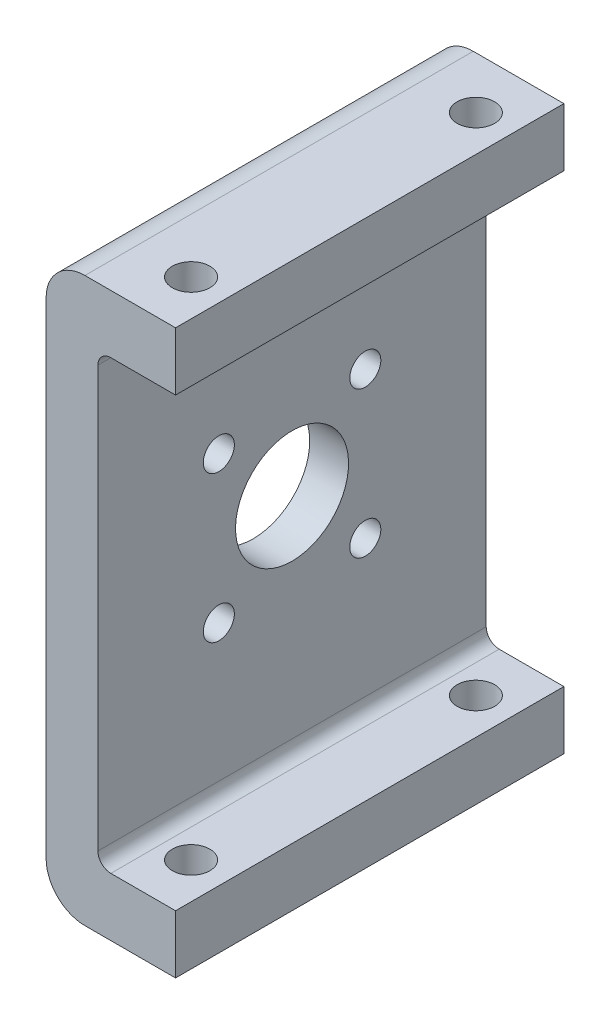
ISO-10303-21;
HEADER;
FILE_DESCRIPTION(('STEP AP214'),'2;1');
FILE_NAME('part.step','',(''),(''),'','','');
FILE_SCHEMA(('AUTOMOTIVE_DESIGN { 1 0 10303 214 1 1 1 1 }'));
ENDSEC;
DATA;
#1=APPLICATION_CONTEXT('core data for automotive mechanical design processes');
#2=APPLICATION_PROTOCOL_DEFINITION('international standard','automotive_design',2000,#1);
#3=PRODUCT_CONTEXT('',#1,'mechanical');
#4=PRODUCT('Part','Part','',(#3));
#5=PRODUCT_RELATED_PRODUCT_CATEGORY('part','',(#4));
#6=PRODUCT_DEFINITION_FORMATION('','',#4);
#7=PRODUCT_DEFINITION_CONTEXT('part definition',#1,'design');
#8=PRODUCT_DEFINITION('design','',#6,#7);
#9=PRODUCT_DEFINITION_SHAPE('','',#8);
#10=(LENGTH_UNIT() NAMED_UNIT(*) SI_UNIT(.MILLI.,.METRE.));
#11=(NAMED_UNIT(*) PLANE_ANGLE_UNIT() SI_UNIT($,.RADIAN.));
#12=(NAMED_UNIT(*) SI_UNIT($,.STERADIAN.) SOLID_ANGLE_UNIT());
#13=UNCERTAINTY_MEASURE_WITH_UNIT(LENGTH_MEASURE(1.E-05),#10,'distance_accuracy_value','');
#14=(GEOMETRIC_REPRESENTATION_CONTEXT(3) GLOBAL_UNCERTAINTY_ASSIGNED_CONTEXT((#13)) GLOBAL_UNIT_ASSIGNED_CONTEXT((#10,
#11,#12)) REPRESENTATION_CONTEXT('',''));
#15=CARTESIAN_POINT('',(0.,0.,0.));
#16=DIRECTION('',(0.,0.,1.));
#17=DIRECTION('',(1.,0.,0.));
#18=AXIS2_PLACEMENT_3D('',#15,#16,#17);
#19=CARTESIAN_POINT('',(0.,0.,0.));
#20=DIRECTION('',(1.,0.,0.));
#21=DIRECTION('',(0.,1.,0.));
#22=AXIS2_PLACEMENT_3D('',#19,#20,#21);
#23=CYLINDRICAL_SURFACE('',#22,4.365625);
#24=CARTESIAN_POINT('',(4.,0.,0.));
#25=DIRECTION('',(-1.,0.,0.));
#26=DIRECTION('',(0.,-1.,0.));
#27=AXIS2_PLACEMENT_3D('',#24,#25,#26);
#28=CIRCLE('',#27,4.365625);
#29=CARTESIAN_POINT('',(4.,-4.365625,0.));
#30=VERTEX_POINT('',#29);
#31=EDGE_CURVE('E195',#30,#30,#28,.T.);
#32=ORIENTED_EDGE('',*,*,#31,.F.);
#33=EDGE_LOOP('',(#32));
#34=FACE_BOUND('',#33,.T.);
#35=CARTESIAN_POINT('',(1.,0.,0.));
#36=DIRECTION('',(-1.,0.,0.));
#37=DIRECTION('',(0.,-1.,0.));
#38=AXIS2_PLACEMENT_3D('',#35,#36,#37);
#39=CIRCLE('',#38,4.365625);
#40=CARTESIAN_POINT('',(1.,-4.365625,0.));
#41=VERTEX_POINT('',#40);
#42=EDGE_CURVE('E208',#41,#41,#39,.F.);
#43=ORIENTED_EDGE('',*,*,#42,.F.);
#44=EDGE_LOOP('',(#43));
#45=FACE_BOUND('',#44,.T.);
#46=ADVANCED_FACE('F45',(#34,#45),#23,.F.);
#47=CARTESIAN_POINT('',(0.,5.656854249492,-5.656854249492));
#48=DIRECTION('',(-1.,0.,0.));
#49=DIRECTION('',(0.,0.,1.));
#50=AXIS2_PLACEMENT_3D('',#47,#48,#49);
#51=CYLINDRICAL_SURFACE('',#50,1.19999999999999);
#52=CARTESIAN_POINT('',(4.,5.656854249492,-5.656854249492));
#53=DIRECTION('',(-1.,0.,0.));
#54=DIRECTION('',(0.,-1.,0.));
#55=AXIS2_PLACEMENT_3D('',#52,#53,#54);
#56=CIRCLE('',#55,1.19999999999999);
#57=CARTESIAN_POINT('',(4.,4.45685424949201,-5.656854249492));
#58=VERTEX_POINT('',#57);
#59=EDGE_CURVE('E191',#58,#58,#56,.T.);
#60=ORIENTED_EDGE('',*,*,#59,.F.);
#61=EDGE_LOOP('',(#60));
#62=FACE_BOUND('',#61,.T.);
#63=CARTESIAN_POINT('',(0.999999999999998,5.656854249492,-5.656854249492));
#64=DIRECTION('',(-1.,0.,0.));
#65=DIRECTION('',(0.,-1.,0.));
#66=AXIS2_PLACEMENT_3D('',#63,#64,#65);
#67=CIRCLE('',#66,1.19999999999999);
#68=CARTESIAN_POINT('',(0.999999999999999,4.45685424949201,-5.656854249492));
#69=VERTEX_POINT('',#68);
#70=EDGE_CURVE('E373',#69,#69,#67,.F.);
#71=ORIENTED_EDGE('',*,*,#70,.F.);
#72=EDGE_LOOP('',(#71));
#73=FACE_BOUND('',#72,.T.);
#74=ADVANCED_FACE('F414',(#62,#73),#51,.F.);
#75=CARTESIAN_POINT('',(0.,-5.656854249492,-5.656854249492));
#76=DIRECTION('',(-1.,0.,0.));
#77=DIRECTION('',(0.,0.,1.));
#78=AXIS2_PLACEMENT_3D('',#75,#76,#77);
#79=CYLINDRICAL_SURFACE('',#78,1.19999999999999);
#80=CARTESIAN_POINT('',(4.,-5.656854249492,-5.656854249492));
#81=DIRECTION('',(-1.,0.,0.));
#82=DIRECTION('',(0.,-1.,0.));
#83=AXIS2_PLACEMENT_3D('',#80,#81,#82);
#84=CIRCLE('',#83,1.19999999999999);
#85=CARTESIAN_POINT('',(4.,-6.85685424949199,-5.656854249492));
#86=VERTEX_POINT('',#85);
#87=EDGE_CURVE('E196',#86,#86,#84,.T.);
#88=ORIENTED_EDGE('',*,*,#87,.F.);
#89=EDGE_LOOP('',(#88));
#90=FACE_BOUND('',#89,.T.);
#91=CARTESIAN_POINT('',(1.,-5.656854249492,-5.656854249492));
#92=DIRECTION('',(-1.,0.,0.));
#93=DIRECTION('',(0.,-1.,0.));
#94=AXIS2_PLACEMENT_3D('',#91,#92,#93);
#95=CIRCLE('',#94,1.19999999999999);
#96=CARTESIAN_POINT('',(1.,-6.85685424949199,-5.656854249492));
#97=VERTEX_POINT('',#96);
#98=EDGE_CURVE('E377',#97,#97,#95,.F.);
#99=ORIENTED_EDGE('',*,*,#98,.F.);
#100=EDGE_LOOP('',(#99));
#101=FACE_BOUND('',#100,.T.);
#102=ADVANCED_FACE('F420',(#90,#101),#79,.F.);
#103=CARTESIAN_POINT('',(0.,-5.656854249492,5.656854249492));
#104=DIRECTION('',(-1.,0.,0.));
#105=DIRECTION('',(0.,0.,1.));
#106=AXIS2_PLACEMENT_3D('',#103,#104,#105);
#107=CYLINDRICAL_SURFACE('',#106,1.19999999999999);
#108=CARTESIAN_POINT('',(4.,-5.656854249492,5.656854249492));
#109=DIRECTION('',(-1.,0.,0.));
#110=DIRECTION('',(0.,-1.,0.));
#111=AXIS2_PLACEMENT_3D('',#108,#109,#110);
#112=CIRCLE('',#111,1.19999999999999);
#113=CARTESIAN_POINT('',(4.,-6.85685424949199,5.656854249492));
#114=VERTEX_POINT('',#113);
#115=EDGE_CURVE('E200',#114,#114,#112,.T.);
#116=ORIENTED_EDGE('',*,*,#115,.F.);
#117=EDGE_LOOP('',(#116));
#118=FACE_BOUND('',#117,.T.);
#119=CARTESIAN_POINT('',(1.,-5.656854249492,5.656854249492));
#120=DIRECTION('',(-1.,0.,0.));
#121=DIRECTION('',(0.,-1.,0.));
#122=AXIS2_PLACEMENT_3D('',#119,#120,#121);
#123=CIRCLE('',#122,1.19999999999999);
#124=CARTESIAN_POINT('',(1.,-6.85685424949199,5.656854249492));
#125=VERTEX_POINT('',#124);
#126=EDGE_CURVE('E212',#125,#125,#123,.F.);
#127=ORIENTED_EDGE('',*,*,#126,.F.);
#128=EDGE_LOOP('',(#127));
#129=FACE_BOUND('',#128,.T.);
#130=ADVANCED_FACE('F446',(#118,#129),#107,.F.);
#131=CARTESIAN_POINT('',(0.,5.656854249492,5.656854249492));
#132=DIRECTION('',(-1.,0.,0.));
#133=DIRECTION('',(0.,0.,1.));
#134=AXIS2_PLACEMENT_3D('',#131,#132,#133);
#135=CYLINDRICAL_SURFACE('',#134,1.19999999999999);
#136=CARTESIAN_POINT('',(4.,5.656854249492,5.656854249492));
#137=DIRECTION('',(-1.,0.,0.));
#138=DIRECTION('',(0.,-1.,0.));
#139=AXIS2_PLACEMENT_3D('',#136,#137,#138);
#140=CIRCLE('',#139,1.19999999999999);
#141=CARTESIAN_POINT('',(4.,4.45685424949201,5.656854249492));
#142=VERTEX_POINT('',#141);
#143=EDGE_CURVE('E204',#142,#142,#140,.T.);
#144=ORIENTED_EDGE('',*,*,#143,.F.);
#145=EDGE_LOOP('',(#144));
#146=FACE_BOUND('',#145,.T.);
#147=CARTESIAN_POINT('',(0.999999999999998,5.656854249492,5.656854249492));
#148=DIRECTION('',(-1.,0.,0.));
#149=DIRECTION('',(0.,-1.,0.));
#150=AXIS2_PLACEMENT_3D('',#147,#148,#149);
#151=CIRCLE('',#150,1.19999999999999);
#152=CARTESIAN_POINT('',(0.999999999999999,4.45685424949201,5.656854249492));
#153=VERTEX_POINT('',#152);
#154=EDGE_CURVE('E209',#153,#153,#151,.F.);
#155=ORIENTED_EDGE('',*,*,#154,.F.);
#156=EDGE_LOOP('',(#155));
#157=FACE_BOUND('',#156,.T.);
#158=ADVANCED_FACE('F439',(#146,#157),#135,.F.);
#159=CARTESIAN_POINT('',(0.,-21.75,15.));
#160=DIRECTION('',(0.,1.,0.));
#161=DIRECTION('',(0.,0.,1.));
#162=AXIS2_PLACEMENT_3D('',#159,#160,#161);
#163=PLANE('',#162);
#164=CARTESIAN_POINT('',(7.20000000000095,-21.75,-11.));
#165=DIRECTION('',(0.,-1.,0.));
#166=DIRECTION('',(0.,0.,-1.));
#167=AXIS2_PLACEMENT_3D('',#164,#165,#166);
#168=CIRCLE('',#167,1.45);
#169=CARTESIAN_POINT('',(7.20000000000095,-21.75,-12.45));
#170=VERTEX_POINT('',#169);
#171=EDGE_CURVE('E353',#170,#170,#168,.T.);
#172=ORIENTED_EDGE('',*,*,#171,.F.);
#173=EDGE_LOOP('',(#172));
#174=FACE_BOUND('',#173,.T.);
#175=DIRECTION('',(1.,0.,0.));
#176=VECTOR('',#175,1.);
#177=CARTESIAN_POINT('',(0.,-21.75,15.));
#178=LINE('',#177,#176);
#179=CARTESIAN_POINT('',(3.,-21.75,15.));
#180=VERTEX_POINT('',#179);
#181=CARTESIAN_POINT('',(10.,-21.75,15.));
#182=VERTEX_POINT('',#181);
#183=EDGE_CURVE('E155',#180,#182,#178,.T.);
#184=ORIENTED_EDGE('',*,*,#183,.F.);
#185=DIRECTION('',(0.,0.,-1.));
#186=VECTOR('',#185,1.);
#187=CARTESIAN_POINT('',(3.,-21.75,15.));
#188=LINE('',#187,#186);
#189=CARTESIAN_POINT('',(3.,-21.75,-15.));
#190=VERTEX_POINT('',#189);
#191=EDGE_CURVE('E236',#180,#190,#188,.T.);
#192=ORIENTED_EDGE('',*,*,#191,.T.);
#193=DIRECTION('',(1.,0.,0.));
#194=VECTOR('',#193,1.);
#195=CARTESIAN_POINT('',(0.,-21.75,-15.));
#196=LINE('',#195,#194);
#197=CARTESIAN_POINT('',(10.,-21.75,-15.));
#198=VERTEX_POINT('',#197);
#199=EDGE_CURVE('E160',#190,#198,#196,.T.);
#200=ORIENTED_EDGE('',*,*,#199,.T.);
#201=DIRECTION('',(0.,0.,-1.));
#202=VECTOR('',#201,1.);
#203=CARTESIAN_POINT('',(10.,-21.75,15.));
#204=LINE('',#203,#202);
#205=EDGE_CURVE('E264',#182,#198,#204,.T.);
#206=ORIENTED_EDGE('',*,*,#205,.F.);
#207=EDGE_LOOP('',(#184,#192,#200,#206));
#208=FACE_BOUND('',#207,.T.);
#209=CARTESIAN_POINT('',(7.20000000000095,-21.75,11.));
#210=DIRECTION('',(0.,-1.,0.));
#211=DIRECTION('',(0.,0.,-1.));
#212=AXIS2_PLACEMENT_3D('',#209,#210,#211);
#213=CIRCLE('',#212,1.45);
#214=CARTESIAN_POINT('',(7.20000000000095,-21.75,9.55));
#215=VERTEX_POINT('',#214);
#216=EDGE_CURVE('E363',#215,#215,#213,.T.);
#217=ORIENTED_EDGE('',*,*,#216,.F.);
#218=EDGE_LOOP('',(#217));
#219=FACE_BOUND('',#218,.T.);
#220=ADVANCED_FACE('F261',(#174,#208,#219),#163,.F.);
#221=CARTESIAN_POINT('',(10.,-21.75,15.));
#222=DIRECTION('',(-1.,0.,0.));
#223=DIRECTION('',(0.,-1.,0.));
#224=AXIS2_PLACEMENT_3D('',#221,#222,#223);
#225=PLANE('',#224);
#226=DIRECTION('',(0.,1.,0.));
#227=VECTOR('',#226,1.);
#228=CARTESIAN_POINT('',(10.,-21.75,-15.));
#229=LINE('',#228,#227);
#230=CARTESIAN_POINT('',(10.,-17.25,-15.));
#231=VERTEX_POINT('',#230);
#232=EDGE_CURVE('E164',#198,#231,#229,.T.);
#233=ORIENTED_EDGE('',*,*,#232,.T.);
#234=DIRECTION('',(0.,0.,-1.));
#235=VECTOR('',#234,1.);
#236=CARTESIAN_POINT('',(10.,-17.25,15.));
#237=LINE('',#236,#235);
#238=CARTESIAN_POINT('',(10.,-17.25,15.));
#239=VERTEX_POINT('',#238);
#240=EDGE_CURVE('E142',#239,#231,#237,.T.);
#241=ORIENTED_EDGE('',*,*,#240,.F.);
#242=DIRECTION('',(0.,1.,0.));
#243=VECTOR('',#242,1.);
#244=CARTESIAN_POINT('',(10.,-21.75,15.));
#245=LINE('',#244,#243);
#246=EDGE_CURVE('E150',#182,#239,#245,.T.);
#247=ORIENTED_EDGE('',*,*,#246,.F.);
#248=ORIENTED_EDGE('',*,*,#205,.T.);
#249=EDGE_LOOP('',(#233,#241,#247,#248));
#250=FACE_BOUND('',#249,.T.);
#251=ADVANCED_FACE('F162',(#250),#225,.F.);
#252=CARTESIAN_POINT('',(10.,-17.25,15.));
#253=DIRECTION('',(0.,-1.,0.));
#254=DIRECTION('',(1.,0.,0.));
#255=AXIS2_PLACEMENT_3D('',#252,#253,#254);
#256=PLANE('',#255);
#257=CARTESIAN_POINT('',(7.20000000000095,-17.25,11.));
#258=DIRECTION('',(0.,-1.,0.));
#259=DIRECTION('',(1.,0.,0.));
#260=AXIS2_PLACEMENT_3D('',#257,#258,#259);
#261=CIRCLE('',#260,1.44999999999999);
#262=CARTESIAN_POINT('',(8.65000000000095,-17.25,11.));
#263=VERTEX_POINT('',#262);
#264=EDGE_CURVE('E189',#263,#263,#261,.T.);
#265=ORIENTED_EDGE('',*,*,#264,.T.);
#266=EDGE_LOOP('',(#265));
#267=FACE_BOUND('',#266,.T.);
#268=CARTESIAN_POINT('',(7.20000000000095,-17.25,-11.));
#269=DIRECTION('',(0.,-1.,0.));
#270=DIRECTION('',(1.,0.,0.));
#271=AXIS2_PLACEMENT_3D('',#268,#269,#270);
#272=CIRCLE('',#271,1.44999999999999);
#273=CARTESIAN_POINT('',(8.65000000000095,-17.25,-11.));
#274=VERTEX_POINT('',#273);
#275=EDGE_CURVE('E179',#274,#274,#272,.T.);
#276=ORIENTED_EDGE('',*,*,#275,.T.);
#277=EDGE_LOOP('',(#276));
#278=FACE_BOUND('',#277,.T.);
#279=DIRECTION('',(-1.,0.,0.));
#280=VECTOR('',#279,1.);
#281=CARTESIAN_POINT('',(10.,-17.25,-15.));
#282=LINE('',#281,#280);
#283=CARTESIAN_POINT('',(5.00000000000001,-17.25,-15.));
#284=VERTEX_POINT('',#283);
#285=EDGE_CURVE('E309',#231,#284,#282,.T.);
#286=ORIENTED_EDGE('',*,*,#285,.T.);
#287=DIRECTION('',(0.,0.,-1.));
#288=VECTOR('',#287,1.);
#289=CARTESIAN_POINT('',(5.00000000000001,-17.25,15.));
#290=LINE('',#289,#288);
#291=CARTESIAN_POINT('',(5.00000000000001,-17.25,15.));
#292=VERTEX_POINT('',#291);
#293=EDGE_CURVE('E145',#284,#292,#290,.F.);
#294=ORIENTED_EDGE('',*,*,#293,.T.);
#295=DIRECTION('',(-1.,0.,0.));
#296=VECTOR('',#295,1.);
#297=CARTESIAN_POINT('',(10.,-17.25,15.));
#298=LINE('',#297,#296);
#299=EDGE_CURVE('E137',#239,#292,#298,.T.);
#300=ORIENTED_EDGE('',*,*,#299,.F.);
#301=ORIENTED_EDGE('',*,*,#240,.T.);
#302=EDGE_LOOP('',(#286,#294,#300,#301));
#303=FACE_BOUND('',#302,.T.);
#304=ADVANCED_FACE('F140',(#267,#278,#303),#256,.F.);
#305=CARTESIAN_POINT('',(4.00000000000001,-17.25,15.));
#306=DIRECTION('',(-1.,0.,0.));
#307=DIRECTION('',(0.,-1.,0.));
#308=AXIS2_PLACEMENT_3D('',#305,#306,#307);
#309=PLANE('',#308);
#310=ORIENTED_EDGE('',*,*,#143,.T.);
#311=EDGE_LOOP('',(#310));
#312=FACE_BOUND('',#311,.T.);
#313=ORIENTED_EDGE('',*,*,#115,.T.);
#314=EDGE_LOOP('',(#313));
#315=FACE_BOUND('',#314,.T.);
#316=ORIENTED_EDGE('',*,*,#87,.T.);
#317=EDGE_LOOP('',(#316));
#318=FACE_BOUND('',#317,.T.);
#319=ORIENTED_EDGE('',*,*,#59,.T.);
#320=EDGE_LOOP('',(#319));
#321=FACE_BOUND('',#320,.T.);
#322=ORIENTED_EDGE('',*,*,#31,.T.);
#323=EDGE_LOOP('',(#322));
#324=FACE_BOUND('',#323,.T.);
#325=DIRECTION('',(0.,1.,0.));
#326=VECTOR('',#325,1.);
#327=CARTESIAN_POINT('',(4.00000000000001,-17.25,15.));
#328=LINE('',#327,#326);
#329=CARTESIAN_POINT('',(4.00000000000001,-16.25,15.));
#330=VERTEX_POINT('',#329);
#331=CARTESIAN_POINT('',(3.99999999999999,16.25,15.));
#332=VERTEX_POINT('',#331);
#333=EDGE_CURVE('E149',#330,#332,#328,.T.);
#334=ORIENTED_EDGE('',*,*,#333,.F.);
#335=DIRECTION('',(0.,0.,-1.));
#336=VECTOR('',#335,1.);
#337=CARTESIAN_POINT('',(4.00000000000001,-16.25,-15.));
#338=LINE('',#337,#336);
#339=CARTESIAN_POINT('',(4.00000000000001,-16.25,-15.));
#340=VERTEX_POINT('',#339);
#341=EDGE_CURVE('E172',#330,#340,#338,.T.);
#342=ORIENTED_EDGE('',*,*,#341,.T.);
#343=DIRECTION('',(0.,1.,0.));
#344=VECTOR('',#343,1.);
#345=CARTESIAN_POINT('',(4.00000000000001,-17.25,-15.));
#346=LINE('',#345,#344);
#347=CARTESIAN_POINT('',(3.99999999999999,16.25,-15.));
#348=VERTEX_POINT('',#347);
#349=EDGE_CURVE('E312',#340,#348,#346,.T.);
#350=ORIENTED_EDGE('',*,*,#349,.T.);
#351=DIRECTION('',(0.,0.,-1.));
#352=VECTOR('',#351,1.);
#353=CARTESIAN_POINT('',(3.99999999999999,16.25,15.));
#354=LINE('',#353,#352);
#355=EDGE_CURVE('E166',#348,#332,#354,.F.);
#356=ORIENTED_EDGE('',*,*,#355,.T.);
#357=EDGE_LOOP('',(#334,#342,#350,#356));
#358=FACE_BOUND('',#357,.T.);
#359=ADVANCED_FACE('F332',(#312,#315,#318,#321,#324,#358),#309,.F.);
#360=CARTESIAN_POINT('',(3.99999999999999,17.25,15.));
#361=DIRECTION('',(0.,1.,0.));
#362=DIRECTION('',(0.,0.,1.));
#363=AXIS2_PLACEMENT_3D('',#360,#361,#362);
#364=PLANE('',#363);
#365=CARTESIAN_POINT('',(7.20000000000095,17.25,11.));
#366=DIRECTION('',(0.,1.,0.));
#367=DIRECTION('',(0.,0.,1.));
#368=AXIS2_PLACEMENT_3D('',#365,#366,#367);
#369=CIRCLE('',#368,1.44999999999999);
#370=CARTESIAN_POINT('',(7.20000000000095,17.25,12.45));
#371=VERTEX_POINT('',#370);
#372=EDGE_CURVE('E185',#371,#371,#369,.T.);
#373=ORIENTED_EDGE('',*,*,#372,.T.);
#374=EDGE_LOOP('',(#373));
#375=FACE_BOUND('',#374,.T.);
#376=CARTESIAN_POINT('',(7.20000000000095,17.25,-11.));
#377=DIRECTION('',(0.,1.,0.));
#378=DIRECTION('',(0.,0.,1.));
#379=AXIS2_PLACEMENT_3D('',#376,#377,#378);
#380=CIRCLE('',#379,1.44999999999999);
#381=CARTESIAN_POINT('',(7.20000000000095,17.25,-9.55000000000001));
#382=VERTEX_POINT('',#381);
#383=EDGE_CURVE('E183',#382,#382,#380,.T.);
#384=ORIENTED_EDGE('',*,*,#383,.T.);
#385=EDGE_LOOP('',(#384));
#386=FACE_BOUND('',#385,.T.);
#387=DIRECTION('',(1.,0.,0.));
#388=VECTOR('',#387,1.);
#389=CARTESIAN_POINT('',(3.99999999999999,17.25,15.));
#390=LINE('',#389,#388);
#391=CARTESIAN_POINT('',(4.99999999999999,17.25,15.));
#392=VERTEX_POINT('',#391);
#393=CARTESIAN_POINT('',(9.99999999999999,17.25,15.));
#394=VERTEX_POINT('',#393);
#395=EDGE_CURVE('E325',#392,#394,#390,.T.);
#396=ORIENTED_EDGE('',*,*,#395,.F.);
#397=DIRECTION('',(0.,0.,-1.));
#398=VECTOR('',#397,1.);
#399=CARTESIAN_POINT('',(4.99999999999999,17.25,-15.));
#400=LINE('',#399,#398);
#401=CARTESIAN_POINT('',(4.99999999999999,17.25,-15.));
#402=VERTEX_POINT('',#401);
#403=EDGE_CURVE('E220',#392,#402,#400,.T.);
#404=ORIENTED_EDGE('',*,*,#403,.T.);
#405=DIRECTION('',(1.,0.,0.));
#406=VECTOR('',#405,1.);
#407=CARTESIAN_POINT('',(3.99999999999999,17.25,-15.));
#408=LINE('',#407,#406);
#409=CARTESIAN_POINT('',(9.99999999999999,17.25,-15.));
#410=VERTEX_POINT('',#409);
#411=EDGE_CURVE('E316',#402,#410,#408,.T.);
#412=ORIENTED_EDGE('',*,*,#411,.T.);
#413=DIRECTION('',(0.,0.,-1.));
#414=VECTOR('',#413,1.);
#415=CARTESIAN_POINT('',(9.99999999999999,17.25,15.));
#416=LINE('',#415,#414);
#417=EDGE_CURVE('E167',#394,#410,#416,.T.);
#418=ORIENTED_EDGE('',*,*,#417,.F.);
#419=EDGE_LOOP('',(#396,#404,#412,#418));
#420=FACE_BOUND('',#419,.T.);
#421=ADVANCED_FACE('F324',(#375,#386,#420),#364,.F.);
#422=CARTESIAN_POINT('',(9.99999999999999,17.25,15.));
#423=DIRECTION('',(-1.,0.,0.));
#424=DIRECTION('',(0.,-1.,0.));
#425=AXIS2_PLACEMENT_3D('',#422,#423,#424);
#426=PLANE('',#425);
#427=DIRECTION('',(0.,1.,0.));
#428=VECTOR('',#427,1.);
#429=CARTESIAN_POINT('',(9.99999999999999,17.25,-15.));
#430=LINE('',#429,#428);
#431=CARTESIAN_POINT('',(9.99999999999999,21.75,-15.));
#432=VERTEX_POINT('',#431);
#433=EDGE_CURVE('E281',#410,#432,#430,.T.);
#434=ORIENTED_EDGE('',*,*,#433,.T.);
#435=DIRECTION('',(0.,0.,-1.));
#436=VECTOR('',#435,1.);
#437=CARTESIAN_POINT('',(9.99999999999999,21.75,15.));
#438=LINE('',#437,#436);
#439=CARTESIAN_POINT('',(9.99999999999999,21.75,15.));
#440=VERTEX_POINT('',#439);
#441=EDGE_CURVE('E175',#440,#432,#438,.T.);
#442=ORIENTED_EDGE('',*,*,#441,.F.);
#443=DIRECTION('',(0.,1.,0.));
#444=VECTOR('',#443,1.);
#445=CARTESIAN_POINT('',(9.99999999999999,17.25,15.));
#446=LINE('',#445,#444);
#447=EDGE_CURVE('E303',#394,#440,#446,.T.);
#448=ORIENTED_EDGE('',*,*,#447,.F.);
#449=ORIENTED_EDGE('',*,*,#417,.T.);
#450=EDGE_LOOP('',(#434,#442,#448,#449));
#451=FACE_BOUND('',#450,.T.);
#452=ADVANCED_FACE('F320',(#451),#426,.F.);
#453=CARTESIAN_POINT('',(9.99999999999999,21.75,15.));
#454=DIRECTION('',(0.,-1.,0.));
#455=DIRECTION('',(1.,0.,0.));
#456=AXIS2_PLACEMENT_3D('',#453,#454,#455);
#457=PLANE('',#456);
#458=CARTESIAN_POINT('',(7.20000000000095,21.75,11.));
#459=DIRECTION('',(0.,-1.,0.));
#460=DIRECTION('',(0.,0.,-1.));
#461=AXIS2_PLACEMENT_3D('',#458,#459,#460);
#462=CIRCLE('',#461,1.44999999999999);
#463=CARTESIAN_POINT('',(7.20000000000095,21.75,9.55000000000001));
#464=VERTEX_POINT('',#463);
#465=EDGE_CURVE('E190',#464,#464,#462,.T.);
#466=ORIENTED_EDGE('',*,*,#465,.T.);
#467=EDGE_LOOP('',(#466));
#468=FACE_BOUND('',#467,.T.);
#469=CARTESIAN_POINT('',(7.20000000000095,21.75,-11.));
#470=DIRECTION('',(0.,-1.,0.));
#471=DIRECTION('',(0.,0.,-1.));
#472=AXIS2_PLACEMENT_3D('',#469,#470,#471);
#473=CIRCLE('',#472,1.44999999999999);
#474=CARTESIAN_POINT('',(7.20000000000095,21.75,-12.45));
#475=VERTEX_POINT('',#474);
#476=EDGE_CURVE('E184',#475,#475,#473,.T.);
#477=ORIENTED_EDGE('',*,*,#476,.T.);
#478=EDGE_LOOP('',(#477));
#479=FACE_BOUND('',#478,.T.);
#480=DIRECTION('',(-1.,0.,0.));
#481=VECTOR('',#480,1.);
#482=CARTESIAN_POINT('',(9.99999999999999,21.75,-15.));
#483=LINE('',#482,#481);
#484=CARTESIAN_POINT('',(2.99999999999999,21.75,-15.));
#485=VERTEX_POINT('',#484);
#486=EDGE_CURVE('E275',#432,#485,#483,.T.);
#487=ORIENTED_EDGE('',*,*,#486,.T.);
#488=DIRECTION('',(0.,0.,-1.));
#489=VECTOR('',#488,1.);
#490=CARTESIAN_POINT('',(2.99999999999999,21.75,15.));
#491=LINE('',#490,#489);
#492=CARTESIAN_POINT('',(2.99999999999999,21.75,15.));
#493=VERTEX_POINT('',#492);
#494=EDGE_CURVE('E11',#485,#493,#491,.F.);
#495=ORIENTED_EDGE('',*,*,#494,.T.);
#496=DIRECTION('',(-1.,0.,0.));
#497=VECTOR('',#496,1.);
#498=CARTESIAN_POINT('',(9.99999999999999,21.75,15.));
#499=LINE('',#498,#497);
#500=EDGE_CURVE('E292',#440,#493,#499,.T.);
#501=ORIENTED_EDGE('',*,*,#500,.F.);
#502=ORIENTED_EDGE('',*,*,#441,.T.);
#503=EDGE_LOOP('',(#487,#495,#501,#502));
#504=FACE_BOUND('',#503,.T.);
#505=ADVANCED_FACE('F291',(#468,#479,#504),#457,.F.);
#506=CARTESIAN_POINT('',(0.,21.75,15.));
#507=DIRECTION('',(1.,0.,0.));
#508=DIRECTION('',(0.,1.,0.));
#509=AXIS2_PLACEMENT_3D('',#506,#507,#508);
#510=PLANE('',#509);
#511=CARTESIAN_POINT('',(0.,0.,0.));
#512=DIRECTION('',(-1.,0.,0.));
#513=DIRECTION('',(0.,-1.,0.));
#514=AXIS2_PLACEMENT_3D('',#511,#512,#513);
#515=CIRCLE('',#514,11.5);
#516=CARTESIAN_POINT('',(0.,-11.5,0.));
#517=VERTEX_POINT('',#516);
#518=EDGE_CURVE('E384',#517,#517,#515,.T.);
#519=ORIENTED_EDGE('',*,*,#518,.F.);
#520=EDGE_LOOP('',(#519));
#521=FACE_BOUND('',#520,.T.);
#522=DIRECTION('',(0.,-1.,0.));
#523=VECTOR('',#522,1.);
#524=CARTESIAN_POINT('',(0.,21.75,-15.));
#525=LINE('',#524,#523);
#526=CARTESIAN_POINT('',(0.,18.75,-15.));
#527=VERTEX_POINT('',#526);
#528=CARTESIAN_POINT('',(0.,-18.75,-15.));
#529=VERTEX_POINT('',#528);
#530=EDGE_CURVE('E271',#527,#529,#525,.T.);
#531=ORIENTED_EDGE('',*,*,#530,.T.);
#532=DIRECTION('',(0.,0.,-1.));
#533=VECTOR('',#532,1.);
#534=CARTESIAN_POINT('',(0.,-18.75,15.));
#535=LINE('',#534,#533);
#536=CARTESIAN_POINT('',(0.,-18.75,15.));
#537=VERTEX_POINT('',#536);
#538=EDGE_CURVE('E67',#529,#537,#535,.F.);
#539=ORIENTED_EDGE('',*,*,#538,.T.);
#540=DIRECTION('',(0.,-1.,0.));
#541=VECTOR('',#540,1.);
#542=CARTESIAN_POINT('',(0.,21.75,15.));
#543=LINE('',#542,#541);
#544=CARTESIAN_POINT('',(0.,18.75,15.));
#545=VERTEX_POINT('',#544);
#546=EDGE_CURVE('E257',#545,#537,#543,.T.);
#547=ORIENTED_EDGE('',*,*,#546,.F.);
#548=DIRECTION('',(0.,0.,-1.));
#549=VECTOR('',#548,1.);
#550=CARTESIAN_POINT('',(0.,18.75,15.));
#551=LINE('',#550,#549);
#552=EDGE_CURVE('E246',#545,#527,#551,.T.);
#553=ORIENTED_EDGE('',*,*,#552,.T.);
#554=EDGE_LOOP('',(#531,#539,#547,#553));
#555=FACE_BOUND('',#554,.T.);
#556=ADVANCED_FACE('F272',(#521,#555),#510,.F.);
#557=CARTESIAN_POINT('',(0.,0.,15.));
#558=DIRECTION('',(0.,0.,1.));
#559=DIRECTION('',(1.,0.,0.));
#560=AXIS2_PLACEMENT_3D('',#557,#558,#559);
#561=PLANE('',#560);
#562=ORIENTED_EDGE('',*,*,#546,.T.);
#563=CARTESIAN_POINT('',(3.,-18.75,15.));
#564=DIRECTION('',(0.,0.,1.));
#565=DIRECTION('',(1.,0.,0.));
#566=AXIS2_PLACEMENT_3D('',#563,#564,#565);
#567=CIRCLE('',#566,3.);
#568=EDGE_CURVE('E54',#537,#180,#567,.T.);
#569=ORIENTED_EDGE('',*,*,#568,.T.);
#570=ORIENTED_EDGE('',*,*,#183,.T.);
#571=ORIENTED_EDGE('',*,*,#246,.T.);
#572=ORIENTED_EDGE('',*,*,#299,.T.);
#573=CARTESIAN_POINT('',(5.00000000000001,-16.25,15.));
#574=DIRECTION('',(0.,0.,1.));
#575=DIRECTION('',(1.,0.,0.));
#576=AXIS2_PLACEMENT_3D('',#573,#574,#575);
#577=CIRCLE('',#576,1.);
#578=EDGE_CURVE('E227',#292,#330,#577,.F.);
#579=ORIENTED_EDGE('',*,*,#578,.T.);
#580=ORIENTED_EDGE('',*,*,#333,.T.);
#581=CARTESIAN_POINT('',(4.99999999999999,16.25,15.));
#582=DIRECTION('',(0.,0.,1.));
#583=DIRECTION('',(1.,0.,0.));
#584=AXIS2_PLACEMENT_3D('',#581,#582,#583);
#585=CIRCLE('',#584,1.);
#586=EDGE_CURVE('E233',#332,#392,#585,.F.);
#587=ORIENTED_EDGE('',*,*,#586,.T.);
#588=ORIENTED_EDGE('',*,*,#395,.T.);
#589=ORIENTED_EDGE('',*,*,#447,.T.);
#590=ORIENTED_EDGE('',*,*,#500,.T.);
#591=CARTESIAN_POINT('',(2.99999999999999,18.75,15.));
#592=DIRECTION('',(0.,0.,1.));
#593=DIRECTION('',(1.,0.,0.));
#594=AXIS2_PLACEMENT_3D('',#591,#592,#593);
#595=CIRCLE('',#594,3.);
#596=EDGE_CURVE('E252',#493,#545,#595,.T.);
#597=ORIENTED_EDGE('',*,*,#596,.T.);
#598=EDGE_LOOP('',(#562,#569,#570,#571,#572,#579,#580,#587,#588,#589,#590,#597));
#599=FACE_BOUND('',#598,.T.);
#600=ADVANCED_FACE('F153',(#599),#561,.T.);
#601=CARTESIAN_POINT('',(0.,0.,-15.));
#602=DIRECTION('',(0.,0.,1.));
#603=DIRECTION('',(1.,0.,0.));
#604=AXIS2_PLACEMENT_3D('',#601,#602,#603);
#605=PLANE('',#604);
#606=ORIENTED_EDGE('',*,*,#199,.F.);
#607=CARTESIAN_POINT('',(3.,-18.75,-15.));
#608=DIRECTION('',(0.,0.,1.));
#609=DIRECTION('',(1.,0.,0.));
#610=AXIS2_PLACEMENT_3D('',#607,#608,#609);
#611=CIRCLE('',#610,3.);
#612=EDGE_CURVE('E243',#190,#529,#611,.F.);
#613=ORIENTED_EDGE('',*,*,#612,.T.);
#614=ORIENTED_EDGE('',*,*,#530,.F.);
#615=CARTESIAN_POINT('',(2.99999999999999,18.75,-15.));
#616=DIRECTION('',(0.,0.,1.));
#617=DIRECTION('',(1.,0.,0.));
#618=AXIS2_PLACEMENT_3D('',#615,#616,#617);
#619=CIRCLE('',#618,3.);
#620=EDGE_CURVE('E240',#527,#485,#619,.F.);
#621=ORIENTED_EDGE('',*,*,#620,.T.);
#622=ORIENTED_EDGE('',*,*,#486,.F.);
#623=ORIENTED_EDGE('',*,*,#433,.F.);
#624=ORIENTED_EDGE('',*,*,#411,.F.);
#625=CARTESIAN_POINT('',(4.99999999999999,16.25,-15.));
#626=DIRECTION('',(0.,0.,1.));
#627=DIRECTION('',(1.,0.,0.));
#628=AXIS2_PLACEMENT_3D('',#625,#626,#627);
#629=CIRCLE('',#628,1.);
#630=EDGE_CURVE('E230',#402,#348,#629,.T.);
#631=ORIENTED_EDGE('',*,*,#630,.T.);
#632=ORIENTED_EDGE('',*,*,#349,.F.);
#633=CARTESIAN_POINT('',(5.00000000000001,-16.25,-15.));
#634=DIRECTION('',(0.,0.,1.));
#635=DIRECTION('',(1.,0.,0.));
#636=AXIS2_PLACEMENT_3D('',#633,#634,#635);
#637=CIRCLE('',#636,1.);
#638=EDGE_CURVE('E224',#340,#284,#637,.T.);
#639=ORIENTED_EDGE('',*,*,#638,.T.);
#640=ORIENTED_EDGE('',*,*,#285,.F.);
#641=ORIENTED_EDGE('',*,*,#232,.F.);
#642=EDGE_LOOP('',(#606,#613,#614,#621,#622,#623,#624,#631,#632,#639,#640,#641));
#643=FACE_BOUND('',#642,.T.);
#644=ADVANCED_FACE('F270',(#643),#605,.F.);
#645=CARTESIAN_POINT('',(7.20000000000095,-21.75,-11.));
#646=DIRECTION('',(0.,-1.,0.));
#647=DIRECTION('',(0.,0.,-1.));
#648=AXIS2_PLACEMENT_3D('',#645,#646,#647);
#649=CYLINDRICAL_SURFACE('',#648,1.44999999999999);
#650=ORIENTED_EDGE('',*,*,#171,.T.);
#651=EDGE_LOOP('',(#650));
#652=FACE_BOUND('',#651,.T.);
#653=ORIENTED_EDGE('',*,*,#275,.F.);
#654=EDGE_LOOP('',(#653));
#655=FACE_BOUND('',#654,.T.);
#656=ADVANCED_FACE('F434',(#652,#655),#649,.F.);
#657=ORIENTED_EDGE('',*,*,#476,.F.);
#658=EDGE_LOOP('',(#657));
#659=FACE_BOUND('',#658,.T.);
#660=ORIENTED_EDGE('',*,*,#383,.F.);
#661=EDGE_LOOP('',(#660));
#662=FACE_BOUND('',#661,.T.);
#663=ADVANCED_FACE('F432',(#659,#662),#649,.F.);
#664=CARTESIAN_POINT('',(7.20000000000095,-21.75,11.));
#665=DIRECTION('',(0.,-1.,0.));
#666=DIRECTION('',(0.,0.,-1.));
#667=AXIS2_PLACEMENT_3D('',#664,#665,#666);
#668=CYLINDRICAL_SURFACE('',#667,1.44999999999999);
#669=ORIENTED_EDGE('',*,*,#465,.F.);
#670=EDGE_LOOP('',(#669));
#671=FACE_BOUND('',#670,.T.);
#672=ORIENTED_EDGE('',*,*,#372,.F.);
#673=EDGE_LOOP('',(#672));
#674=FACE_BOUND('',#673,.T.);
#675=ADVANCED_FACE('F430',(#671,#674),#668,.F.);
#676=ORIENTED_EDGE('',*,*,#216,.T.);
#677=EDGE_LOOP('',(#676));
#678=FACE_BOUND('',#677,.T.);
#679=ORIENTED_EDGE('',*,*,#264,.F.);
#680=EDGE_LOOP('',(#679));
#681=FACE_BOUND('',#680,.T.);
#682=ADVANCED_FACE('F427',(#678,#681),#668,.F.);
#683=CARTESIAN_POINT('',(1.,0.,0.));
#684=DIRECTION('',(-1.,0.,0.));
#685=DIRECTION('',(0.,-1.,0.));
#686=AXIS2_PLACEMENT_3D('',#683,#684,#685);
#687=PLANE('',#686);
#688=CARTESIAN_POINT('',(1.,0.,0.));
#689=DIRECTION('',(-1.,0.,0.));
#690=DIRECTION('',(0.,-1.,0.));
#691=AXIS2_PLACEMENT_3D('',#688,#689,#690);
#692=CIRCLE('',#691,11.5);
#693=CARTESIAN_POINT('',(1.,-11.5,0.));
#694=VERTEX_POINT('',#693);
#695=EDGE_CURVE('E213',#694,#694,#692,.T.);
#696=ORIENTED_EDGE('',*,*,#695,.T.);
#697=EDGE_LOOP('',(#696));
#698=FACE_BOUND('',#697,.T.);
#699=ORIENTED_EDGE('',*,*,#154,.T.);
#700=EDGE_LOOP('',(#699));
#701=FACE_BOUND('',#700,.T.);
#702=ORIENTED_EDGE('',*,*,#126,.T.);
#703=EDGE_LOOP('',(#702));
#704=FACE_BOUND('',#703,.T.);
#705=ORIENTED_EDGE('',*,*,#98,.T.);
#706=EDGE_LOOP('',(#705));
#707=FACE_BOUND('',#706,.T.);
#708=ORIENTED_EDGE('',*,*,#70,.T.);
#709=EDGE_LOOP('',(#708));
#710=FACE_BOUND('',#709,.T.);
#711=ORIENTED_EDGE('',*,*,#42,.T.);
#712=EDGE_LOOP('',(#711));
#713=FACE_BOUND('',#712,.T.);
#714=ADVANCED_FACE('F393',(#698,#701,#704,#707,#710,#713),#687,.T.);
#715=CARTESIAN_POINT('',(1.,0.,0.));
#716=DIRECTION('',(-1.,0.,0.));
#717=DIRECTION('',(0.,-1.,0.));
#718=AXIS2_PLACEMENT_3D('',#715,#716,#717);
#719=CYLINDRICAL_SURFACE('',#718,11.5);
#720=ORIENTED_EDGE('',*,*,#695,.F.);
#721=EDGE_LOOP('',(#720));
#722=FACE_BOUND('',#721,.T.);
#723=ORIENTED_EDGE('',*,*,#518,.T.);
#724=EDGE_LOOP('',(#723));
#725=FACE_BOUND('',#724,.T.);
#726=ADVANCED_FACE('F396',(#722,#725),#719,.F.);
#727=CARTESIAN_POINT('',(5.00000000000001,-16.25,15.));
#728=DIRECTION('',(0.,0.,1.));
#729=DIRECTION('',(1.,0.,0.));
#730=AXIS2_PLACEMENT_3D('',#727,#728,#729);
#731=CYLINDRICAL_SURFACE('',#730,1.);
#732=ORIENTED_EDGE('',*,*,#578,.F.);
#733=ORIENTED_EDGE('',*,*,#293,.F.);
#734=ORIENTED_EDGE('',*,*,#638,.F.);
#735=ORIENTED_EDGE('',*,*,#341,.F.);
#736=EDGE_LOOP('',(#732,#733,#734,#735));
#737=FACE_BOUND('',#736,.T.);
#738=ADVANCED_FACE('F399',(#737),#731,.F.);
#739=CARTESIAN_POINT('',(4.99999999999999,16.25,15.));
#740=DIRECTION('',(0.,0.,1.));
#741=DIRECTION('',(1.,0.,0.));
#742=AXIS2_PLACEMENT_3D('',#739,#740,#741);
#743=CYLINDRICAL_SURFACE('',#742,1.);
#744=ORIENTED_EDGE('',*,*,#586,.F.);
#745=ORIENTED_EDGE('',*,*,#355,.F.);
#746=ORIENTED_EDGE('',*,*,#630,.F.);
#747=ORIENTED_EDGE('',*,*,#403,.F.);
#748=EDGE_LOOP('',(#744,#745,#746,#747));
#749=FACE_BOUND('',#748,.T.);
#750=ADVANCED_FACE('F336',(#749),#743,.F.);
#751=CARTESIAN_POINT('',(3.,-18.75,15.));
#752=DIRECTION('',(0.,0.,-1.));
#753=DIRECTION('',(-1.,0.,0.));
#754=AXIS2_PLACEMENT_3D('',#751,#752,#753);
#755=CYLINDRICAL_SURFACE('',#754,3.);
#756=ORIENTED_EDGE('',*,*,#568,.F.);
#757=ORIENTED_EDGE('',*,*,#538,.F.);
#758=ORIENTED_EDGE('',*,*,#612,.F.);
#759=ORIENTED_EDGE('',*,*,#191,.F.);
#760=EDGE_LOOP('',(#756,#757,#758,#759));
#761=FACE_BOUND('',#760,.T.);
#762=ADVANCED_FACE('F267',(#761),#755,.T.);
#763=CARTESIAN_POINT('',(2.99999999999999,18.75,15.));
#764=DIRECTION('',(0.,0.,-1.));
#765=DIRECTION('',(-1.,0.,0.));
#766=AXIS2_PLACEMENT_3D('',#763,#764,#765);
#767=CYLINDRICAL_SURFACE('',#766,3.);
#768=ORIENTED_EDGE('',*,*,#596,.F.);
#769=ORIENTED_EDGE('',*,*,#494,.F.);
#770=ORIENTED_EDGE('',*,*,#620,.F.);
#771=ORIENTED_EDGE('',*,*,#552,.F.);
#772=EDGE_LOOP('',(#768,#769,#770,#771));
#773=FACE_BOUND('',#772,.T.);
#774=ADVANCED_FACE('F47',(#773),#767,.T.);
#775=CLOSED_SHELL('',(#46,#74,#102,#130,#158,#220,#251,#304,#359,#421,#452,#505,#556,#600,#644,
#656,#663,#675,#682,#714,#726,#738,#750,#762,#774));
#776=MANIFOLD_SOLID_BREP('B2',#775);
#777=ADVANCED_BREP_SHAPE_REPRESENTATION('',(#18,#776),#14);
#778=SHAPE_DEFINITION_REPRESENTATION(#9,#777);
ENDSEC;
END-ISO-10303-21;
